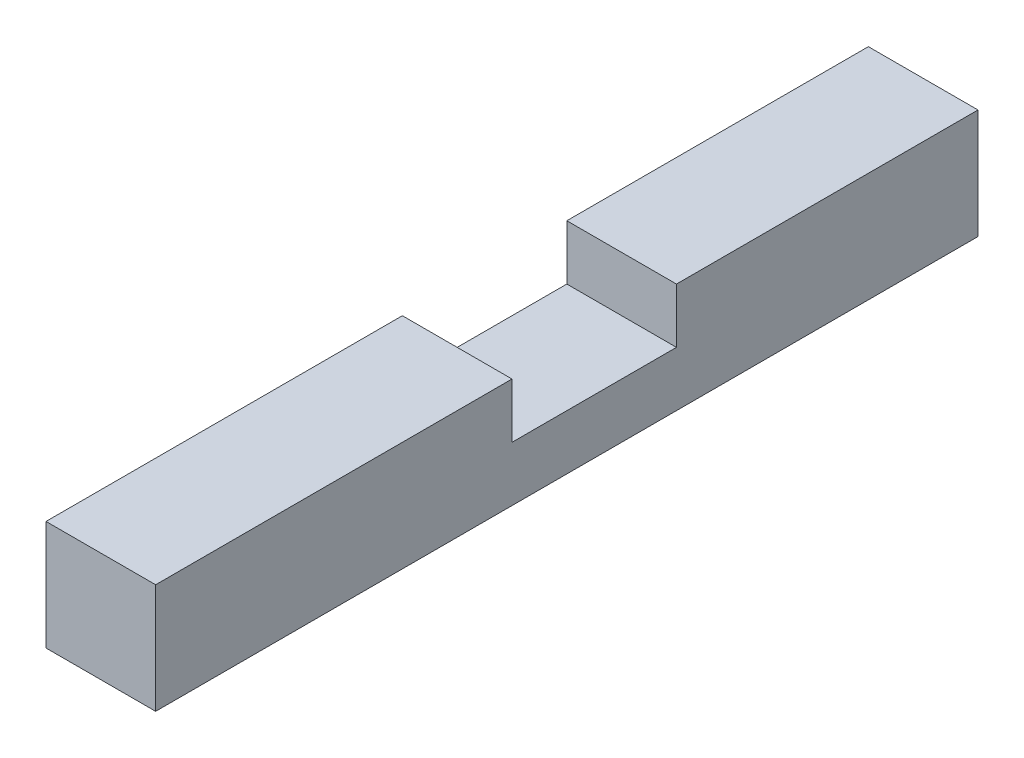
ISO-10303-21;
HEADER;
FILE_DESCRIPTION(('STEP AP214'),'2;1');
FILE_NAME('part.step','',(''),(''),'','','');
FILE_SCHEMA(('AUTOMOTIVE_DESIGN { 1 0 10303 214 1 1 1 1 }'));
ENDSEC;
DATA;
#1=APPLICATION_CONTEXT('core data for automotive mechanical design processes');
#2=APPLICATION_PROTOCOL_DEFINITION('international standard','automotive_design',2000,#1);
#3=PRODUCT_CONTEXT('',#1,'mechanical');
#4=PRODUCT('Part','Part','',(#3));
#5=PRODUCT_RELATED_PRODUCT_CATEGORY('part','',(#4));
#6=PRODUCT_DEFINITION_FORMATION('','',#4);
#7=PRODUCT_DEFINITION_CONTEXT('part definition',#1,'design');
#8=PRODUCT_DEFINITION('design','',#6,#7);
#9=PRODUCT_DEFINITION_SHAPE('','',#8);
#10=(LENGTH_UNIT() NAMED_UNIT(*) SI_UNIT(.MILLI.,.METRE.));
#11=(NAMED_UNIT(*) PLANE_ANGLE_UNIT() SI_UNIT($,.RADIAN.));
#12=(NAMED_UNIT(*) SI_UNIT($,.STERADIAN.) SOLID_ANGLE_UNIT());
#13=UNCERTAINTY_MEASURE_WITH_UNIT(LENGTH_MEASURE(1.E-05),#10,'distance_accuracy_value','');
#14=(GEOMETRIC_REPRESENTATION_CONTEXT(3) GLOBAL_UNCERTAINTY_ASSIGNED_CONTEXT((#13)) GLOBAL_UNIT_ASSIGNED_CONTEXT((#10,
#11,#12)) REPRESENTATION_CONTEXT('',''));
#15=CARTESIAN_POINT('',(0.,0.,0.));
#16=DIRECTION('',(0.,0.,1.));
#17=DIRECTION('',(1.,0.,0.));
#18=AXIS2_PLACEMENT_3D('',#15,#16,#17);
#19=CARTESIAN_POINT('',(-2.,2.,30.));
#20=DIRECTION('',(0.,1.,0.));
#21=DIRECTION('',(0.,0.,1.));
#22=AXIS2_PLACEMENT_3D('',#19,#20,#21);
#23=PLANE('',#22);
#24=DIRECTION('',(-1.,0.,0.));
#25=VECTOR('',#24,1.);
#26=CARTESIAN_POINT('',(2.,2.,11.));
#27=LINE('',#26,#25);
#28=CARTESIAN_POINT('',(2.,2.,11.));
#29=VERTEX_POINT('',#28);
#30=CARTESIAN_POINT('',(-2.,2.,11.));
#31=VERTEX_POINT('',#30);
#32=EDGE_CURVE('E139',#29,#31,#27,.T.);
#33=ORIENTED_EDGE('',*,*,#32,.F.);
#34=DIRECTION('',(0.,0.,-1.));
#35=VECTOR('',#34,1.);
#36=CARTESIAN_POINT('',(2.,2.,30.));
#37=LINE('',#36,#35);
#38=CARTESIAN_POINT('',(2.,2.,0.));
#39=VERTEX_POINT('',#38);
#40=EDGE_CURVE('E131',#29,#39,#37,.T.);
#41=ORIENTED_EDGE('',*,*,#40,.T.);
#42=DIRECTION('',(1.,0.,0.));
#43=VECTOR('',#42,1.);
#44=CARTESIAN_POINT('',(-2.,2.,0.));
#45=LINE('',#44,#43);
#46=CARTESIAN_POINT('',(-2.,2.,0.));
#47=VERTEX_POINT('',#46);
#48=EDGE_CURVE('E147',#47,#39,#45,.T.);
#49=ORIENTED_EDGE('',*,*,#48,.F.);
#50=DIRECTION('',(0.,0.,-1.));
#51=VECTOR('',#50,1.);
#52=CARTESIAN_POINT('',(-2.,2.,30.));
#53=LINE('',#52,#51);
#54=EDGE_CURVE('E79',#31,#47,#53,.T.);
#55=ORIENTED_EDGE('',*,*,#54,.F.);
#56=EDGE_LOOP('',(#33,#41,#49,#55));
#57=FACE_BOUND('',#56,.T.);
#58=ADVANCED_FACE('F33',(#57),#23,.T.);
#59=CARTESIAN_POINT('',(-2.,2.,30.));
#60=DIRECTION('',(1.,0.,0.));
#61=DIRECTION('',(0.,1.,0.));
#62=AXIS2_PLACEMENT_3D('',#59,#60,#61);
#63=PLANE('',#62);
#64=DIRECTION('',(0.,0.,1.));
#65=VECTOR('',#64,1.);
#66=CARTESIAN_POINT('',(-2.,0.,11.));
#67=LINE('',#66,#65);
#68=CARTESIAN_POINT('',(-2.,0.,11.));
#69=VERTEX_POINT('',#68);
#70=CARTESIAN_POINT('',(-2.,0.,17.));
#71=VERTEX_POINT('',#70);
#72=EDGE_CURVE('E133',#69,#71,#67,.T.);
#73=ORIENTED_EDGE('',*,*,#72,.F.);
#74=DIRECTION('',(0.,-1.,0.));
#75=VECTOR('',#74,1.);
#76=CARTESIAN_POINT('',(-2.,2.,11.));
#77=LINE('',#76,#75);
#78=EDGE_CURVE('E114',#31,#69,#77,.T.);
#79=ORIENTED_EDGE('',*,*,#78,.F.);
#80=ORIENTED_EDGE('',*,*,#54,.T.);
#81=DIRECTION('',(0.,-1.,0.));
#82=VECTOR('',#81,1.);
#83=CARTESIAN_POINT('',(-2.,2.,0.));
#84=LINE('',#83,#82);
#85=CARTESIAN_POINT('',(-2.,-2.,0.));
#86=VERTEX_POINT('',#85);
#87=EDGE_CURVE('E141',#47,#86,#84,.T.);
#88=ORIENTED_EDGE('',*,*,#87,.T.);
#89=DIRECTION('',(0.,0.,-1.));
#90=VECTOR('',#89,1.);
#91=CARTESIAN_POINT('',(-2.,-2.,30.));
#92=LINE('',#91,#90);
#93=CARTESIAN_POINT('',(-2.,-2.,30.));
#94=VERTEX_POINT('',#93);
#95=EDGE_CURVE('E11',#94,#86,#92,.T.);
#96=ORIENTED_EDGE('',*,*,#95,.F.);
#97=DIRECTION('',(0.,-1.,0.));
#98=VECTOR('',#97,1.);
#99=CARTESIAN_POINT('',(-2.,2.,30.));
#100=LINE('',#99,#98);
#101=CARTESIAN_POINT('',(-2.,2.,30.));
#102=VERTEX_POINT('',#101);
#103=EDGE_CURVE('E145',#102,#94,#100,.T.);
#104=ORIENTED_EDGE('',*,*,#103,.F.);
#105=CARTESIAN_POINT('',(-2.,2.,17.));
#106=VERTEX_POINT('',#105);
#107=EDGE_CURVE('E56',#102,#106,#53,.T.);
#108=ORIENTED_EDGE('',*,*,#107,.T.);
#109=DIRECTION('',(0.,1.,0.));
#110=VECTOR('',#109,1.);
#111=CARTESIAN_POINT('',(-2.,2.,17.));
#112=LINE('',#111,#110);
#113=EDGE_CURVE('E48',#71,#106,#112,.T.);
#114=ORIENTED_EDGE('',*,*,#113,.F.);
#115=EDGE_LOOP('',(#73,#79,#80,#88,#96,#104,#108,#114));
#116=FACE_BOUND('',#115,.T.);
#117=ADVANCED_FACE('F35',(#116),#63,.F.);
#118=CARTESIAN_POINT('',(-2.,-2.,30.));
#119=DIRECTION('',(0.,1.,0.));
#120=DIRECTION('',(0.,0.,1.));
#121=AXIS2_PLACEMENT_3D('',#118,#119,#120);
#122=PLANE('',#121);
#123=DIRECTION('',(1.,0.,0.));
#124=VECTOR('',#123,1.);
#125=CARTESIAN_POINT('',(-2.,-2.,0.));
#126=LINE('',#125,#124);
#127=CARTESIAN_POINT('',(2.,-2.,0.));
#128=VERTEX_POINT('',#127);
#129=EDGE_CURVE('E155',#86,#128,#126,.T.);
#130=ORIENTED_EDGE('',*,*,#129,.T.);
#131=DIRECTION('',(0.,0.,-1.));
#132=VECTOR('',#131,1.);
#133=CARTESIAN_POINT('',(2.,-2.,30.));
#134=LINE('',#133,#132);
#135=CARTESIAN_POINT('',(2.,-2.,30.));
#136=VERTEX_POINT('',#135);
#137=EDGE_CURVE('E41',#136,#128,#134,.T.);
#138=ORIENTED_EDGE('',*,*,#137,.F.);
#139=DIRECTION('',(1.,0.,0.));
#140=VECTOR('',#139,1.);
#141=CARTESIAN_POINT('',(-2.,-2.,30.));
#142=LINE('',#141,#140);
#143=EDGE_CURVE('E86',#94,#136,#142,.T.);
#144=ORIENTED_EDGE('',*,*,#143,.F.);
#145=ORIENTED_EDGE('',*,*,#95,.T.);
#146=EDGE_LOOP('',(#130,#138,#144,#145));
#147=FACE_BOUND('',#146,.T.);
#148=ADVANCED_FACE('F167',(#147),#122,.F.);
#149=CARTESIAN_POINT('',(2.,2.,30.));
#150=DIRECTION('',(1.,0.,0.));
#151=DIRECTION('',(0.,1.,0.));
#152=AXIS2_PLACEMENT_3D('',#149,#150,#151);
#153=PLANE('',#152);
#154=DIRECTION('',(0.,-1.,0.));
#155=VECTOR('',#154,1.);
#156=CARTESIAN_POINT('',(2.,2.,11.));
#157=LINE('',#156,#155);
#158=CARTESIAN_POINT('',(2.,0.,11.));
#159=VERTEX_POINT('',#158);
#160=EDGE_CURVE('E112',#29,#159,#157,.T.);
#161=ORIENTED_EDGE('',*,*,#160,.T.);
#162=DIRECTION('',(0.,0.,1.));
#163=VECTOR('',#162,1.);
#164=CARTESIAN_POINT('',(2.,0.,11.));
#165=LINE('',#164,#163);
#166=CARTESIAN_POINT('',(2.,0.,17.));
#167=VERTEX_POINT('',#166);
#168=EDGE_CURVE('E122',#159,#167,#165,.T.);
#169=ORIENTED_EDGE('',*,*,#168,.T.);
#170=DIRECTION('',(0.,1.,0.));
#171=VECTOR('',#170,1.);
#172=CARTESIAN_POINT('',(2.,2.,17.));
#173=LINE('',#172,#171);
#174=CARTESIAN_POINT('',(2.,2.,17.));
#175=VERTEX_POINT('',#174);
#176=EDGE_CURVE('E119',#167,#175,#173,.T.);
#177=ORIENTED_EDGE('',*,*,#176,.T.);
#178=CARTESIAN_POINT('',(2.,2.,30.));
#179=VERTEX_POINT('',#178);
#180=EDGE_CURVE('E164',#179,#175,#37,.T.);
#181=ORIENTED_EDGE('',*,*,#180,.F.);
#182=DIRECTION('',(0.,-1.,0.));
#183=VECTOR('',#182,1.);
#184=CARTESIAN_POINT('',(2.,2.,30.));
#185=LINE('',#184,#183);
#186=EDGE_CURVE('E149',#179,#136,#185,.T.);
#187=ORIENTED_EDGE('',*,*,#186,.T.);
#188=ORIENTED_EDGE('',*,*,#137,.T.);
#189=DIRECTION('',(0.,-1.,0.));
#190=VECTOR('',#189,1.);
#191=CARTESIAN_POINT('',(2.,2.,0.));
#192=LINE('',#191,#190);
#193=EDGE_CURVE('E158',#39,#128,#192,.T.);
#194=ORIENTED_EDGE('',*,*,#193,.F.);
#195=ORIENTED_EDGE('',*,*,#40,.F.);
#196=EDGE_LOOP('',(#161,#169,#177,#181,#187,#188,#194,#195));
#197=FACE_BOUND('',#196,.T.);
#198=ADVANCED_FACE('F129',(#197),#153,.T.);
#199=DIRECTION('',(-1.,0.,0.));
#200=VECTOR('',#199,1.);
#201=CARTESIAN_POINT('',(2.,2.,17.));
#202=LINE('',#201,#200);
#203=EDGE_CURVE('E142',#175,#106,#202,.T.);
#204=ORIENTED_EDGE('',*,*,#203,.T.);
#205=ORIENTED_EDGE('',*,*,#107,.F.);
#206=DIRECTION('',(1.,0.,0.));
#207=VECTOR('',#206,1.);
#208=CARTESIAN_POINT('',(-2.,2.,30.));
#209=LINE('',#208,#207);
#210=EDGE_CURVE('E152',#102,#179,#209,.T.);
#211=ORIENTED_EDGE('',*,*,#210,.T.);
#212=ORIENTED_EDGE('',*,*,#180,.T.);
#213=EDGE_LOOP('',(#204,#205,#211,#212));
#214=FACE_BOUND('',#213,.T.);
#215=ADVANCED_FACE('F176',(#214),#23,.T.);
#216=CARTESIAN_POINT('',(0.,0.,30.));
#217=DIRECTION('',(0.,0.,1.));
#218=DIRECTION('',(1.,0.,0.));
#219=AXIS2_PLACEMENT_3D('',#216,#217,#218);
#220=PLANE('',#219);
#221=ORIENTED_EDGE('',*,*,#103,.T.);
#222=ORIENTED_EDGE('',*,*,#143,.T.);
#223=ORIENTED_EDGE('',*,*,#186,.F.);
#224=ORIENTED_EDGE('',*,*,#210,.F.);
#225=EDGE_LOOP('',(#221,#222,#223,#224));
#226=FACE_BOUND('',#225,.T.);
#227=ADVANCED_FACE('F175',(#226),#220,.T.);
#228=CARTESIAN_POINT('',(0.,0.,0.));
#229=DIRECTION('',(0.,0.,1.));
#230=DIRECTION('',(1.,0.,0.));
#231=AXIS2_PLACEMENT_3D('',#228,#229,#230);
#232=PLANE('',#231);
#233=ORIENTED_EDGE('',*,*,#87,.F.);
#234=ORIENTED_EDGE('',*,*,#48,.T.);
#235=ORIENTED_EDGE('',*,*,#193,.T.);
#236=ORIENTED_EDGE('',*,*,#129,.F.);
#237=EDGE_LOOP('',(#233,#234,#235,#236));
#238=FACE_BOUND('',#237,.T.);
#239=ADVANCED_FACE('F170',(#238),#232,.F.);
#240=CARTESIAN_POINT('',(2.,2.,11.));
#241=DIRECTION('',(0.,0.,-1.));
#242=DIRECTION('',(-1.,0.,0.));
#243=AXIS2_PLACEMENT_3D('',#240,#241,#242);
#244=PLANE('',#243);
#245=ORIENTED_EDGE('',*,*,#78,.T.);
#246=DIRECTION('',(-1.,0.,0.));
#247=VECTOR('',#246,1.);
#248=CARTESIAN_POINT('',(2.,0.,11.));
#249=LINE('',#248,#247);
#250=EDGE_CURVE('E108',#159,#69,#249,.T.);
#251=ORIENTED_EDGE('',*,*,#250,.F.);
#252=ORIENTED_EDGE('',*,*,#160,.F.);
#253=ORIENTED_EDGE('',*,*,#32,.T.);
#254=EDGE_LOOP('',(#245,#251,#252,#253));
#255=FACE_BOUND('',#254,.T.);
#256=ADVANCED_FACE('F110',(#255),#244,.F.);
#257=CARTESIAN_POINT('',(2.,2.,17.));
#258=DIRECTION('',(0.,0.,1.));
#259=DIRECTION('',(1.,0.,0.));
#260=AXIS2_PLACEMENT_3D('',#257,#258,#259);
#261=PLANE('',#260);
#262=ORIENTED_EDGE('',*,*,#113,.T.);
#263=ORIENTED_EDGE('',*,*,#203,.F.);
#264=ORIENTED_EDGE('',*,*,#176,.F.);
#265=DIRECTION('',(-1.,0.,0.));
#266=VECTOR('',#265,1.);
#267=CARTESIAN_POINT('',(2.,0.,17.));
#268=LINE('',#267,#266);
#269=EDGE_CURVE('E118',#167,#71,#268,.T.);
#270=ORIENTED_EDGE('',*,*,#269,.T.);
#271=EDGE_LOOP('',(#262,#263,#264,#270));
#272=FACE_BOUND('',#271,.T.);
#273=ADVANCED_FACE('F177',(#272),#261,.F.);
#274=CARTESIAN_POINT('',(2.,0.,11.));
#275=DIRECTION('',(0.,-1.,0.));
#276=DIRECTION('',(1.,0.,0.));
#277=AXIS2_PLACEMENT_3D('',#274,#275,#276);
#278=PLANE('',#277);
#279=ORIENTED_EDGE('',*,*,#72,.T.);
#280=ORIENTED_EDGE('',*,*,#269,.F.);
#281=ORIENTED_EDGE('',*,*,#168,.F.);
#282=ORIENTED_EDGE('',*,*,#250,.T.);
#283=EDGE_LOOP('',(#279,#280,#281,#282));
#284=FACE_BOUND('',#283,.T.);
#285=ADVANCED_FACE('F123',(#284),#278,.F.);
#286=CLOSED_SHELL('',(#58,#117,#148,#198,#215,#227,#239,#256,#273,#285));
#287=MANIFOLD_SOLID_BREP('B2',#286);
#288=ADVANCED_BREP_SHAPE_REPRESENTATION('',(#18,#287),#14);
#289=SHAPE_DEFINITION_REPRESENTATION(#9,#288);
ENDSEC;
END-ISO-10303-21;
